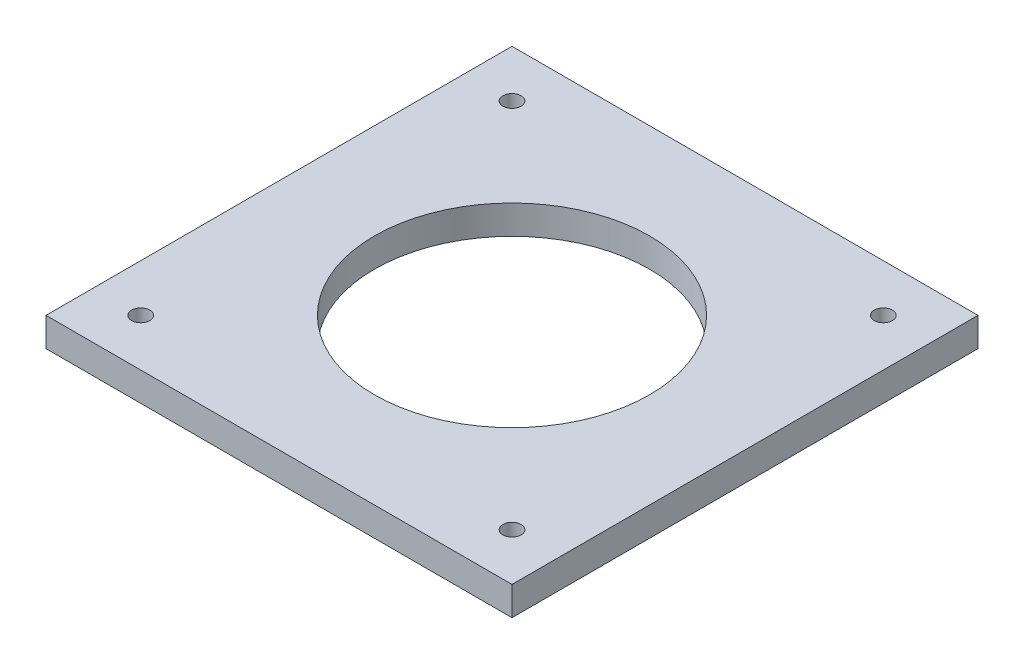
ISO-10303-21;
HEADER;
FILE_DESCRIPTION(('STEP AP214'),'2;1');
FILE_NAME('part.step','',(''),(''),'','','');
FILE_SCHEMA(('AUTOMOTIVE_DESIGN { 1 0 10303 214 1 1 1 1 }'));
ENDSEC;
DATA;
#1=APPLICATION_CONTEXT('core data for automotive mechanical design processes');
#2=APPLICATION_PROTOCOL_DEFINITION('international standard','automotive_design',2000,#1);
#3=PRODUCT_CONTEXT('',#1,'mechanical');
#4=PRODUCT('Part','Part','',(#3));
#5=PRODUCT_RELATED_PRODUCT_CATEGORY('part','',(#4));
#6=PRODUCT_DEFINITION_FORMATION('','',#4);
#7=PRODUCT_DEFINITION_CONTEXT('part definition',#1,'design');
#8=PRODUCT_DEFINITION('design','',#6,#7);
#9=PRODUCT_DEFINITION_SHAPE('','',#8);
#10=(LENGTH_UNIT() NAMED_UNIT(*) SI_UNIT(.MILLI.,.METRE.));
#11=(NAMED_UNIT(*) PLANE_ANGLE_UNIT() SI_UNIT($,.RADIAN.));
#12=(NAMED_UNIT(*) SI_UNIT($,.STERADIAN.) SOLID_ANGLE_UNIT());
#13=UNCERTAINTY_MEASURE_WITH_UNIT(LENGTH_MEASURE(1.E-05),#10,'distance_accuracy_value','');
#14=(GEOMETRIC_REPRESENTATION_CONTEXT(3) GLOBAL_UNCERTAINTY_ASSIGNED_CONTEXT((#13)) GLOBAL_UNIT_ASSIGNED_CONTEXT((#10,
#11,#12)) REPRESENTATION_CONTEXT('',''));
#15=CARTESIAN_POINT('',(0.,0.,0.));
#16=DIRECTION('',(0.,0.,1.));
#17=DIRECTION('',(1.,0.,0.));
#18=AXIS2_PLACEMENT_3D('',#15,#16,#17);
#19=CARTESIAN_POINT('',(0.,6.29,0.));
#20=DIRECTION('',(0.,1.,0.));
#21=DIRECTION('',(0.,0.,1.));
#22=AXIS2_PLACEMENT_3D('',#19,#20,#21);
#23=PLANE('',#22);
#24=CARTESIAN_POINT('',(40.4799999999997,6.29,40.4800000000003));
#25=DIRECTION('',(0.,1.,0.));
#26=DIRECTION('',(0.,0.,1.));
#27=AXIS2_PLACEMENT_3D('',#24,#25,#26);
#28=CIRCLE('',#27,1.98499999999999);
#29=CARTESIAN_POINT('',(40.4799999999997,6.29,42.4650000000003));
#30=VERTEX_POINT('',#29);
#31=EDGE_CURVE('E160',#30,#30,#28,.T.);
#32=ORIENTED_EDGE('',*,*,#31,.F.);
#33=EDGE_LOOP('',(#32));
#34=FACE_BOUND('',#33,.T.);
#35=CARTESIAN_POINT('',(-40.48,6.29,-40.48));
#36=DIRECTION('',(0.,1.,0.));
#37=DIRECTION('',(0.,0.,1.));
#38=AXIS2_PLACEMENT_3D('',#35,#36,#37);
#39=CIRCLE('',#38,1.98499999999999);
#40=CARTESIAN_POINT('',(-40.48,6.29,-38.495));
#41=VERTEX_POINT('',#40);
#42=EDGE_CURVE('E144',#41,#41,#39,.T.);
#43=ORIENTED_EDGE('',*,*,#42,.F.);
#44=EDGE_LOOP('',(#43));
#45=FACE_BOUND('',#44,.T.);
#46=DIRECTION('',(0.,0.,1.));
#47=VECTOR('',#46,1.);
#48=CARTESIAN_POINT('',(-50.8,6.29,-50.8));
#49=LINE('',#48,#47);
#50=CARTESIAN_POINT('',(-50.8,6.29,-50.8));
#51=VERTEX_POINT('',#50);
#52=CARTESIAN_POINT('',(-50.8,6.29,50.8));
#53=VERTEX_POINT('',#52);
#54=EDGE_CURVE('E102',#51,#53,#49,.T.);
#55=ORIENTED_EDGE('',*,*,#54,.T.);
#56=DIRECTION('',(1.,0.,0.));
#57=VECTOR('',#56,1.);
#58=CARTESIAN_POINT('',(-50.8,6.29,50.8));
#59=LINE('',#58,#57);
#60=CARTESIAN_POINT('',(50.8,6.29,50.8));
#61=VERTEX_POINT('',#60);
#62=EDGE_CURVE('E97',#53,#61,#59,.T.);
#63=ORIENTED_EDGE('',*,*,#62,.T.);
#64=DIRECTION('',(0.,0.,-1.));
#65=VECTOR('',#64,1.);
#66=CARTESIAN_POINT('',(50.8,6.29,-50.8));
#67=LINE('',#66,#65);
#68=CARTESIAN_POINT('',(50.8,6.29,-50.8));
#69=VERTEX_POINT('',#68);
#70=EDGE_CURVE('E100',#61,#69,#67,.T.);
#71=ORIENTED_EDGE('',*,*,#70,.T.);
#72=DIRECTION('',(-1.,0.,0.));
#73=VECTOR('',#72,1.);
#74=CARTESIAN_POINT('',(-50.8,6.29,-50.8));
#75=LINE('',#74,#73);
#76=EDGE_CURVE('E67',#69,#51,#75,.T.);
#77=ORIENTED_EDGE('',*,*,#76,.T.);
#78=EDGE_LOOP('',(#55,#63,#71,#77));
#79=FACE_BOUND('',#78,.T.);
#80=CARTESIAN_POINT('',(0.,6.29,0.));
#81=DIRECTION('',(0.,1.,0.));
#82=DIRECTION('',(0.,0.,1.));
#83=AXIS2_PLACEMENT_3D('',#80,#81,#82);
#84=CIRCLE('',#83,30.);
#85=CARTESIAN_POINT('',(0.,6.29,30.));
#86=VERTEX_POINT('',#85);
#87=EDGE_CURVE('E122',#86,#86,#84,.T.);
#88=ORIENTED_EDGE('',*,*,#87,.F.);
#89=EDGE_LOOP('',(#88));
#90=FACE_BOUND('',#89,.T.);
#91=CARTESIAN_POINT('',(40.4800000000001,6.29,-40.4799999999999));
#92=DIRECTION('',(0.,1.,0.));
#93=DIRECTION('',(0.,0.,1.));
#94=AXIS2_PLACEMENT_3D('',#91,#92,#93);
#95=CIRCLE('',#94,1.985);
#96=CARTESIAN_POINT('',(40.4800000000001,6.29,-38.4949999999999));
#97=VERTEX_POINT('',#96);
#98=EDGE_CURVE('E152',#97,#97,#95,.T.);
#99=ORIENTED_EDGE('',*,*,#98,.F.);
#100=EDGE_LOOP('',(#99));
#101=FACE_BOUND('',#100,.T.);
#102=CARTESIAN_POINT('',(-40.4800000000004,6.29,40.4799999999996));
#103=DIRECTION('',(0.,1.,0.));
#104=DIRECTION('',(0.,0.,1.));
#105=AXIS2_PLACEMENT_3D('',#102,#103,#104);
#106=CIRCLE('',#105,1.98499999999999);
#107=CARTESIAN_POINT('',(-40.4800000000004,6.29,42.4649999999996));
#108=VERTEX_POINT('',#107);
#109=EDGE_CURVE('E168',#108,#108,#106,.T.);
#110=ORIENTED_EDGE('',*,*,#109,.F.);
#111=EDGE_LOOP('',(#110));
#112=FACE_BOUND('',#111,.T.);
#113=ADVANCED_FACE('F49',(#34,#45,#79,#90,#101,#112),#23,.T.);
#114=CARTESIAN_POINT('',(0.,0.,0.));
#115=DIRECTION('',(0.,1.,0.));
#116=DIRECTION('',(0.,0.,1.));
#117=AXIS2_PLACEMENT_3D('',#114,#115,#116);
#118=PLANE('',#117);
#119=DIRECTION('',(0.,0.,1.));
#120=VECTOR('',#119,1.);
#121=CARTESIAN_POINT('',(-50.8,0.,-50.8));
#122=LINE('',#121,#120);
#123=CARTESIAN_POINT('',(-50.8,0.,-50.8));
#124=VERTEX_POINT('',#123);
#125=CARTESIAN_POINT('',(-50.8,0.,50.8));
#126=VERTEX_POINT('',#125);
#127=EDGE_CURVE('E118',#124,#126,#122,.T.);
#128=ORIENTED_EDGE('',*,*,#127,.F.);
#129=DIRECTION('',(-1.,0.,0.));
#130=VECTOR('',#129,1.);
#131=CARTESIAN_POINT('',(-50.8,0.,-50.8));
#132=LINE('',#131,#130);
#133=CARTESIAN_POINT('',(50.8,0.,-50.8));
#134=VERTEX_POINT('',#133);
#135=EDGE_CURVE('E90',#134,#124,#132,.T.);
#136=ORIENTED_EDGE('',*,*,#135,.F.);
#137=DIRECTION('',(0.,0.,-1.));
#138=VECTOR('',#137,1.);
#139=CARTESIAN_POINT('',(50.8,0.,-50.8));
#140=LINE('',#139,#138);
#141=CARTESIAN_POINT('',(50.8,0.,50.8));
#142=VERTEX_POINT('',#141);
#143=EDGE_CURVE('E84',#142,#134,#140,.T.);
#144=ORIENTED_EDGE('',*,*,#143,.F.);
#145=DIRECTION('',(1.,0.,0.));
#146=VECTOR('',#145,1.);
#147=CARTESIAN_POINT('',(-50.8,0.,50.8));
#148=LINE('',#147,#146);
#149=EDGE_CURVE('E107',#126,#142,#148,.T.);
#150=ORIENTED_EDGE('',*,*,#149,.F.);
#151=EDGE_LOOP('',(#128,#136,#144,#150));
#152=FACE_BOUND('',#151,.T.);
#153=CARTESIAN_POINT('',(0.,0.,0.));
#154=DIRECTION('',(0.,1.,0.));
#155=DIRECTION('',(0.,0.,1.));
#156=AXIS2_PLACEMENT_3D('',#153,#154,#155);
#157=CIRCLE('',#156,30.);
#158=CARTESIAN_POINT('',(0.,0.,30.));
#159=VERTEX_POINT('',#158);
#160=EDGE_CURVE('E140',#159,#159,#157,.T.);
#161=ORIENTED_EDGE('',*,*,#160,.T.);
#162=EDGE_LOOP('',(#161));
#163=FACE_BOUND('',#162,.T.);
#164=CARTESIAN_POINT('',(-40.48,0.,-40.48));
#165=DIRECTION('',(0.,1.,0.));
#166=DIRECTION('',(0.,0.,1.));
#167=AXIS2_PLACEMENT_3D('',#164,#165,#166);
#168=CIRCLE('',#167,1.98499999999999);
#169=CARTESIAN_POINT('',(-40.48,0.,-38.495));
#170=VERTEX_POINT('',#169);
#171=EDGE_CURVE('E148',#170,#170,#168,.T.);
#172=ORIENTED_EDGE('',*,*,#171,.T.);
#173=EDGE_LOOP('',(#172));
#174=FACE_BOUND('',#173,.T.);
#175=CARTESIAN_POINT('',(40.4800000000001,0.,-40.4799999999999));
#176=DIRECTION('',(0.,1.,0.));
#177=DIRECTION('',(0.,0.,1.));
#178=AXIS2_PLACEMENT_3D('',#175,#176,#177);
#179=CIRCLE('',#178,1.985);
#180=CARTESIAN_POINT('',(40.4800000000001,0.,-38.4949999999999));
#181=VERTEX_POINT('',#180);
#182=EDGE_CURVE('E156',#181,#181,#179,.T.);
#183=ORIENTED_EDGE('',*,*,#182,.T.);
#184=EDGE_LOOP('',(#183));
#185=FACE_BOUND('',#184,.T.);
#186=CARTESIAN_POINT('',(40.4799999999997,0.,40.4800000000003));
#187=DIRECTION('',(0.,1.,0.));
#188=DIRECTION('',(0.,0.,1.));
#189=AXIS2_PLACEMENT_3D('',#186,#187,#188);
#190=CIRCLE('',#189,1.98499999999999);
#191=CARTESIAN_POINT('',(40.4799999999997,0.,42.4650000000003));
#192=VERTEX_POINT('',#191);
#193=EDGE_CURVE('E164',#192,#192,#190,.T.);
#194=ORIENTED_EDGE('',*,*,#193,.T.);
#195=EDGE_LOOP('',(#194));
#196=FACE_BOUND('',#195,.T.);
#197=CARTESIAN_POINT('',(-40.4800000000004,0.,40.4799999999996));
#198=DIRECTION('',(0.,1.,0.));
#199=DIRECTION('',(0.,0.,1.));
#200=AXIS2_PLACEMENT_3D('',#197,#198,#199);
#201=CIRCLE('',#200,1.98499999999999);
#202=CARTESIAN_POINT('',(-40.4800000000004,0.,42.4649999999996));
#203=VERTEX_POINT('',#202);
#204=EDGE_CURVE('E172',#203,#203,#201,.T.);
#205=ORIENTED_EDGE('',*,*,#204,.T.);
#206=EDGE_LOOP('',(#205));
#207=FACE_BOUND('',#206,.T.);
#208=ADVANCED_FACE('F135',(#152,#163,#174,#185,#196,#207),#118,.F.);
#209=CARTESIAN_POINT('',(-50.8,6.29,-50.8));
#210=DIRECTION('',(1.,0.,0.));
#211=DIRECTION('',(0.,0.,-1.));
#212=AXIS2_PLACEMENT_3D('',#209,#210,#211);
#213=PLANE('',#212);
#214=ORIENTED_EDGE('',*,*,#127,.T.);
#215=DIRECTION('',(0.,-1.,0.));
#216=VECTOR('',#215,1.);
#217=CARTESIAN_POINT('',(-50.8,6.29,50.8));
#218=LINE('',#217,#216);
#219=EDGE_CURVE('E11',#53,#126,#218,.T.);
#220=ORIENTED_EDGE('',*,*,#219,.F.);
#221=ORIENTED_EDGE('',*,*,#54,.F.);
#222=DIRECTION('',(0.,-1.,0.));
#223=VECTOR('',#222,1.);
#224=CARTESIAN_POINT('',(-50.8,6.29,-50.8));
#225=LINE('',#224,#223);
#226=EDGE_CURVE('E114',#51,#124,#225,.T.);
#227=ORIENTED_EDGE('',*,*,#226,.T.);
#228=EDGE_LOOP('',(#214,#220,#221,#227));
#229=FACE_BOUND('',#228,.T.);
#230=ADVANCED_FACE('F51',(#229),#213,.F.);
#231=CARTESIAN_POINT('',(-50.8,6.29,50.8));
#232=DIRECTION('',(0.,0.,-1.));
#233=DIRECTION('',(-1.,0.,0.));
#234=AXIS2_PLACEMENT_3D('',#231,#232,#233);
#235=PLANE('',#234);
#236=ORIENTED_EDGE('',*,*,#149,.T.);
#237=DIRECTION('',(0.,-1.,0.));
#238=VECTOR('',#237,1.);
#239=CARTESIAN_POINT('',(50.8,6.29,50.8));
#240=LINE('',#239,#238);
#241=EDGE_CURVE('E59',#61,#142,#240,.T.);
#242=ORIENTED_EDGE('',*,*,#241,.F.);
#243=ORIENTED_EDGE('',*,*,#62,.F.);
#244=ORIENTED_EDGE('',*,*,#219,.T.);
#245=EDGE_LOOP('',(#236,#242,#243,#244));
#246=FACE_BOUND('',#245,.T.);
#247=ADVANCED_FACE('F106',(#246),#235,.F.);
#248=CARTESIAN_POINT('',(50.8,6.29,-50.8));
#249=DIRECTION('',(-1.,0.,0.));
#250=DIRECTION('',(0.,0.,1.));
#251=AXIS2_PLACEMENT_3D('',#248,#249,#250);
#252=PLANE('',#251);
#253=ORIENTED_EDGE('',*,*,#143,.T.);
#254=DIRECTION('',(0.,-1.,0.));
#255=VECTOR('',#254,1.);
#256=CARTESIAN_POINT('',(50.8,6.29,-50.8));
#257=LINE('',#256,#255);
#258=EDGE_CURVE('E109',#69,#134,#257,.T.);
#259=ORIENTED_EDGE('',*,*,#258,.F.);
#260=ORIENTED_EDGE('',*,*,#70,.F.);
#261=ORIENTED_EDGE('',*,*,#241,.T.);
#262=EDGE_LOOP('',(#253,#259,#260,#261));
#263=FACE_BOUND('',#262,.T.);
#264=ADVANCED_FACE('F110',(#263),#252,.F.);
#265=CARTESIAN_POINT('',(-50.8,6.29,-50.8));
#266=DIRECTION('',(0.,0.,1.));
#267=DIRECTION('',(1.,0.,0.));
#268=AXIS2_PLACEMENT_3D('',#265,#266,#267);
#269=PLANE('',#268);
#270=ORIENTED_EDGE('',*,*,#135,.T.);
#271=ORIENTED_EDGE('',*,*,#226,.F.);
#272=ORIENTED_EDGE('',*,*,#76,.F.);
#273=ORIENTED_EDGE('',*,*,#258,.T.);
#274=EDGE_LOOP('',(#270,#271,#272,#273));
#275=FACE_BOUND('',#274,.T.);
#276=ADVANCED_FACE('F132',(#275),#269,.F.);
#277=CARTESIAN_POINT('',(0.,6.29,0.));
#278=DIRECTION('',(0.,-1.,0.));
#279=DIRECTION('',(0.,0.,-1.));
#280=AXIS2_PLACEMENT_3D('',#277,#278,#279);
#281=CYLINDRICAL_SURFACE('',#280,30.);
#282=ORIENTED_EDGE('',*,*,#87,.T.);
#283=EDGE_LOOP('',(#282));
#284=FACE_BOUND('',#283,.T.);
#285=ORIENTED_EDGE('',*,*,#160,.F.);
#286=EDGE_LOOP('',(#285));
#287=FACE_BOUND('',#286,.T.);
#288=ADVANCED_FACE('F192',(#284,#287),#281,.F.);
#289=CARTESIAN_POINT('',(-40.48,6.29,-40.48));
#290=DIRECTION('',(0.,-1.,0.));
#291=DIRECTION('',(0.,0.,-1.));
#292=AXIS2_PLACEMENT_3D('',#289,#290,#291);
#293=CYLINDRICAL_SURFACE('',#292,1.98499999999999);
#294=ORIENTED_EDGE('',*,*,#42,.T.);
#295=EDGE_LOOP('',(#294));
#296=FACE_BOUND('',#295,.T.);
#297=ORIENTED_EDGE('',*,*,#171,.F.);
#298=EDGE_LOOP('',(#297));
#299=FACE_BOUND('',#298,.T.);
#300=ADVANCED_FACE('F240',(#296,#299),#293,.F.);
#301=CARTESIAN_POINT('',(40.4800000000001,6.29,-40.4799999999999));
#302=DIRECTION('',(0.,-1.,0.));
#303=DIRECTION('',(0.,0.,-1.));
#304=AXIS2_PLACEMENT_3D('',#301,#302,#303);
#305=CYLINDRICAL_SURFACE('',#304,1.985);
#306=ORIENTED_EDGE('',*,*,#98,.T.);
#307=EDGE_LOOP('',(#306));
#308=FACE_BOUND('',#307,.T.);
#309=ORIENTED_EDGE('',*,*,#182,.F.);
#310=EDGE_LOOP('',(#309));
#311=FACE_BOUND('',#310,.T.);
#312=ADVANCED_FACE('F248',(#308,#311),#305,.F.);
#313=CARTESIAN_POINT('',(40.4799999999997,6.29,40.4800000000003));
#314=DIRECTION('',(0.,-1.,0.));
#315=DIRECTION('',(0.,0.,-1.));
#316=AXIS2_PLACEMENT_3D('',#313,#314,#315);
#317=CYLINDRICAL_SURFACE('',#316,1.98499999999999);
#318=ORIENTED_EDGE('',*,*,#31,.T.);
#319=EDGE_LOOP('',(#318));
#320=FACE_BOUND('',#319,.T.);
#321=ORIENTED_EDGE('',*,*,#193,.F.);
#322=EDGE_LOOP('',(#321));
#323=FACE_BOUND('',#322,.T.);
#324=ADVANCED_FACE('F256',(#320,#323),#317,.F.);
#325=CARTESIAN_POINT('',(-40.4800000000004,6.29,40.4799999999996));
#326=DIRECTION('',(0.,-1.,0.));
#327=DIRECTION('',(0.,0.,-1.));
#328=AXIS2_PLACEMENT_3D('',#325,#326,#327);
#329=CYLINDRICAL_SURFACE('',#328,1.98499999999999);
#330=ORIENTED_EDGE('',*,*,#109,.T.);
#331=EDGE_LOOP('',(#330));
#332=FACE_BOUND('',#331,.T.);
#333=ORIENTED_EDGE('',*,*,#204,.F.);
#334=EDGE_LOOP('',(#333));
#335=FACE_BOUND('',#334,.T.);
#336=ADVANCED_FACE('F180',(#332,#335),#329,.F.);
#337=CLOSED_SHELL('',(#113,#208,#230,#247,#264,#276,#288,#300,#312,#324,#336));
#338=MANIFOLD_SOLID_BREP('B2',#337);
#339=ADVANCED_BREP_SHAPE_REPRESENTATION('',(#18,#338),#14);
#340=SHAPE_DEFINITION_REPRESENTATION(#9,#339);
ENDSEC;
END-ISO-10303-21;
